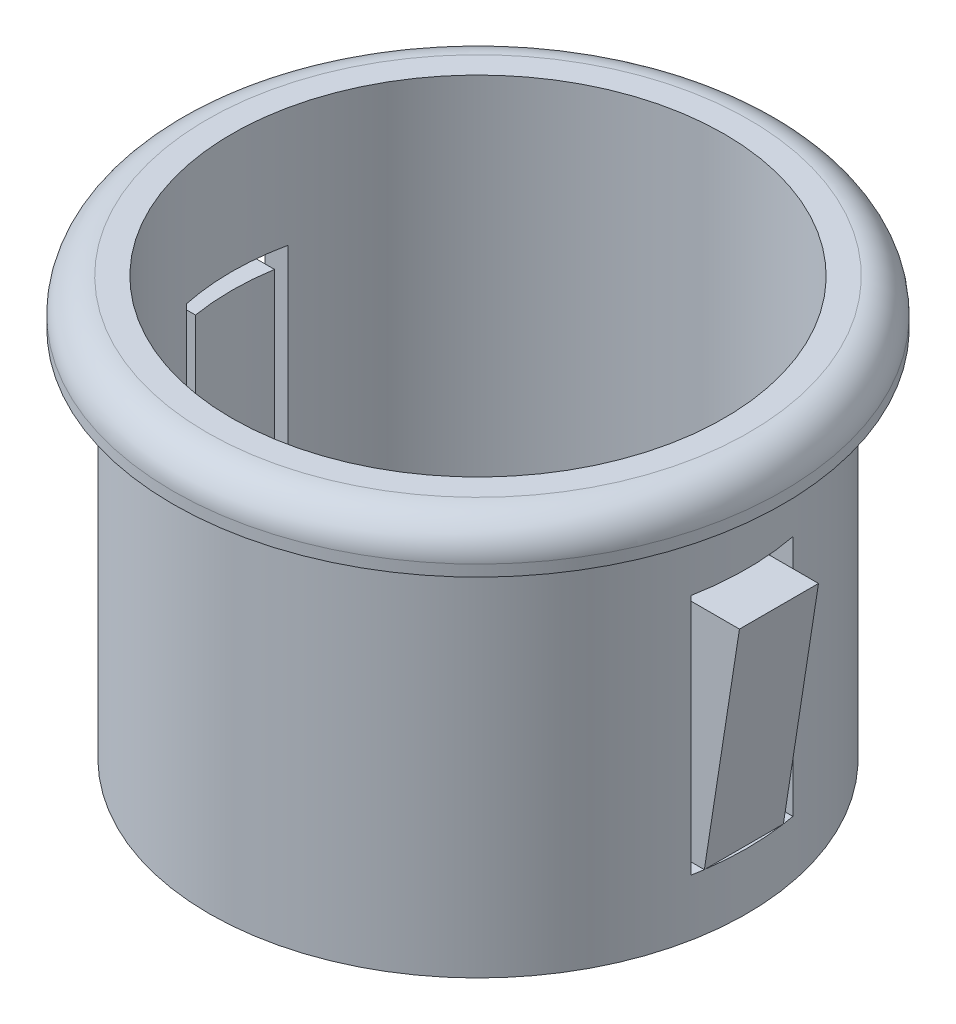
ISO-10303-21;
HEADER;
FILE_DESCRIPTION(('STEP AP214'),'2;1');
FILE_NAME('part.step','',(''),(''),'','','');
FILE_SCHEMA(('AUTOMOTIVE_DESIGN { 1 0 10303 214 1 1 1 1 }'));
ENDSEC;
DATA;
#1=APPLICATION_CONTEXT('core data for automotive mechanical design processes');
#2=APPLICATION_PROTOCOL_DEFINITION('international standard','automotive_design',2000,#1);
#3=PRODUCT_CONTEXT('',#1,'mechanical');
#4=PRODUCT('Part','Part','',(#3));
#5=PRODUCT_RELATED_PRODUCT_CATEGORY('part','',(#4));
#6=PRODUCT_DEFINITION_FORMATION('','',#4);
#7=PRODUCT_DEFINITION_CONTEXT('part definition',#1,'design');
#8=PRODUCT_DEFINITION('design','',#6,#7);
#9=PRODUCT_DEFINITION_SHAPE('','',#8);
#10=(LENGTH_UNIT() NAMED_UNIT(*) SI_UNIT(.MILLI.,.METRE.));
#11=(NAMED_UNIT(*) PLANE_ANGLE_UNIT() SI_UNIT($,.RADIAN.));
#12=(NAMED_UNIT(*) SI_UNIT($,.STERADIAN.) SOLID_ANGLE_UNIT());
#13=UNCERTAINTY_MEASURE_WITH_UNIT(LENGTH_MEASURE(1.E-05),#10,'distance_accuracy_value','');
#14=(GEOMETRIC_REPRESENTATION_CONTEXT(3) GLOBAL_UNCERTAINTY_ASSIGNED_CONTEXT((#13)) GLOBAL_UNIT_ASSIGNED_CONTEXT((#10,
#11,#12)) REPRESENTATION_CONTEXT('',''));
#15=CARTESIAN_POINT('',(0.,0.,0.));
#16=DIRECTION('',(0.,0.,1.));
#17=DIRECTION('',(1.,0.,0.));
#18=AXIS2_PLACEMENT_3D('',#15,#16,#17);
#19=CARTESIAN_POINT('',(-17.1,2.5011409756876,2.24750468608904));
#20=DIRECTION('',(0.,-1.,0.));
#21=DIRECTION('',(0.,0.,-1.));
#22=AXIS2_PLACEMENT_3D('',#19,#20,#21);
#23=PLANE('',#22);
#24=CARTESIAN_POINT('',(0.,2.5011409756876,0.));
#25=DIRECTION('',(0.,-1.,0.));
#26=DIRECTION('',(0.,0.,-1.));
#27=AXIS2_PLACEMENT_3D('',#24,#25,#26);
#28=CIRCLE('',#27,10.9);
#29=CARTESIAN_POINT('',(10.6647205711546,2.5011409756876,-2.25249531391097));
#30=VERTEX_POINT('',#29);
#31=CARTESIAN_POINT('',(10.7586012101946,2.5011409756876,-1.75));
#32=VERTEX_POINT('',#31);
#33=EDGE_CURVE('E239',#30,#32,#28,.T.);
#34=ORIENTED_EDGE('',*,*,#33,.T.);
#35=DIRECTION('',(-1.,0.,0.));
#36=VECTOR('',#35,1.);
#37=CARTESIAN_POINT('',(-17.1,2.5011409756876,-1.75));
#38=LINE('',#37,#36);
#39=CARTESIAN_POINT('',(11.7706202045602,2.5011409756876,-1.75));
#40=VERTEX_POINT('',#39);
#41=EDGE_CURVE('E272',#40,#32,#38,.T.);
#42=ORIENTED_EDGE('',*,*,#41,.F.);
#43=CARTESIAN_POINT('',(0.,2.5011409756876,0.));
#44=DIRECTION('',(0.,-1.,0.));
#45=DIRECTION('',(0.,0.,-1.));
#46=AXIS2_PLACEMENT_3D('',#43,#44,#45);
#47=CIRCLE('',#46,11.9);
#48=CARTESIAN_POINT('',(11.6848733352488,2.5011409756876,-2.25249531391097));
#49=VERTEX_POINT('',#48);
#50=EDGE_CURVE('E377',#49,#40,#47,.T.);
#51=ORIENTED_EDGE('',*,*,#50,.F.);
#52=DIRECTION('',(1.,0.,0.));
#53=VECTOR('',#52,1.);
#54=CARTESIAN_POINT('',(-17.1,2.5011409756876,-2.25249531391096));
#55=LINE('',#54,#53);
#56=EDGE_CURVE('E358',#30,#49,#55,.T.);
#57=ORIENTED_EDGE('',*,*,#56,.F.);
#58=EDGE_LOOP('',(#34,#42,#51,#57));
#59=FACE_BOUND('',#58,.T.);
#60=ADVANCED_FACE('F41',(#59),#23,.F.);
#61=DIRECTION('',(1.,0.,0.));
#62=VECTOR('',#61,1.);
#63=CARTESIAN_POINT('',(-17.1,2.5011409756876,-1.75));
#64=LINE('',#63,#62);
#65=CARTESIAN_POINT('',(-11.7706202045602,2.5011409756876,-1.75));
#66=VERTEX_POINT('',#65);
#67=CARTESIAN_POINT('',(-10.7586012101946,2.5011409756876,-1.75));
#68=VERTEX_POINT('',#67);
#69=EDGE_CURVE('E209',#66,#68,#64,.T.);
#70=ORIENTED_EDGE('',*,*,#69,.T.);
#71=CARTESIAN_POINT('',(-10.6647205711546,2.5011409756876,-2.25249531391097));
#72=VERTEX_POINT('',#71);
#73=EDGE_CURVE('E222',#68,#72,#28,.T.);
#74=ORIENTED_EDGE('',*,*,#73,.T.);
#75=CARTESIAN_POINT('',(-11.6848733352488,2.5011409756876,-2.25249531391097));
#76=VERTEX_POINT('',#75);
#77=EDGE_CURVE('E362',#76,#72,#55,.T.);
#78=ORIENTED_EDGE('',*,*,#77,.F.);
#79=EDGE_CURVE('E224',#66,#76,#47,.T.);
#80=ORIENTED_EDGE('',*,*,#79,.F.);
#81=EDGE_LOOP('',(#70,#74,#78,#80));
#82=FACE_BOUND('',#81,.T.);
#83=ADVANCED_FACE('F220',(#82),#23,.F.);
#84=CARTESIAN_POINT('',(-10.665773421839,2.5011409756876,2.24750468608903));
#85=VERTEX_POINT('',#84);
#86=CARTESIAN_POINT('',(-10.7586012101946,2.5011409756876,1.75));
#87=VERTEX_POINT('',#86);
#88=EDGE_CURVE('E236',#85,#87,#28,.T.);
#89=ORIENTED_EDGE('',*,*,#88,.T.);
#90=DIRECTION('',(1.,0.,0.));
#91=VECTOR('',#90,1.);
#92=CARTESIAN_POINT('',(-17.1,2.5011409756876,1.75));
#93=LINE('',#92,#91);
#94=CARTESIAN_POINT('',(-11.7706202045602,2.5011409756876,1.75));
#95=VERTEX_POINT('',#94);
#96=EDGE_CURVE('E227',#95,#87,#93,.T.);
#97=ORIENTED_EDGE('',*,*,#96,.F.);
#98=CARTESIAN_POINT('',(-11.685834274283,2.5011409756876,2.24750468608903));
#99=VERTEX_POINT('',#98);
#100=EDGE_CURVE('E371',#99,#95,#47,.T.);
#101=ORIENTED_EDGE('',*,*,#100,.F.);
#102=DIRECTION('',(1.,0.,0.));
#103=VECTOR('',#102,1.);
#104=CARTESIAN_POINT('',(-17.1,2.5011409756876,2.24750468608904));
#105=LINE('',#104,#103);
#106=EDGE_CURVE('E363',#99,#85,#105,.T.);
#107=ORIENTED_EDGE('',*,*,#106,.T.);
#108=EDGE_LOOP('',(#89,#97,#101,#107));
#109=FACE_BOUND('',#108,.T.);
#110=ADVANCED_FACE('F500',(#109),#23,.F.);
#111=CARTESIAN_POINT('',(0.,12.5011409756876,-1.75));
#112=DIRECTION('',(0.,0.,1.));
#113=DIRECTION('',(1.,0.,0.));
#114=AXIS2_PLACEMENT_3D('',#111,#112,#113);
#115=PLANE('',#114);
#116=ORIENTED_EDGE('',*,*,#41,.T.);
#117=DIRECTION('',(0.,1.,0.));
#118=VECTOR('',#117,1.);
#119=CARTESIAN_POINT('',(10.7586012101946,-28.3298556597335,-1.75));
#120=LINE('',#119,#118);
#121=CARTESIAN_POINT('',(10.7586012101946,12.5011409756876,-1.75));
#122=VERTEX_POINT('',#121);
#123=EDGE_CURVE('E57',#32,#122,#120,.T.);
#124=ORIENTED_EDGE('',*,*,#123,.T.);
#125=DIRECTION('',(-1.,0.,0.));
#126=VECTOR('',#125,1.);
#127=CARTESIAN_POINT('',(0.,12.5011409756876,-1.75));
#128=LINE('',#127,#126);
#129=CARTESIAN_POINT('',(13.325,12.5011409756876,-1.75));
#130=VERTEX_POINT('',#129);
#131=EDGE_CURVE('E330',#130,#122,#128,.T.);
#132=ORIENTED_EDGE('',*,*,#131,.F.);
#133=DIRECTION('',(0.153593569272711,0.988134108043068,0.));
#134=VECTOR('',#133,1.);
#135=CARTESIAN_POINT('',(13.0106501312453,10.4787918067332,-1.75));
#136=LINE('',#135,#134);
#137=EDGE_CURVE('E323',#40,#130,#136,.T.);
#138=ORIENTED_EDGE('',*,*,#137,.F.);
#139=EDGE_LOOP('',(#116,#124,#132,#138));
#140=FACE_BOUND('',#139,.T.);
#141=ADVANCED_FACE('F614',(#140),#115,.F.);
#142=CARTESIAN_POINT('',(0.,12.5011409756876,1.75));
#143=DIRECTION('',(0.,0.,1.));
#144=DIRECTION('',(1.,0.,0.));
#145=AXIS2_PLACEMENT_3D('',#142,#143,#144);
#146=PLANE('',#145);
#147=DIRECTION('',(0.,1.,0.));
#148=VECTOR('',#147,1.);
#149=CARTESIAN_POINT('',(10.7586012101946,-28.3298556597335,1.75));
#150=LINE('',#149,#148);
#151=CARTESIAN_POINT('',(10.7586012101946,2.5011409756876,1.75));
#152=VERTEX_POINT('',#151);
#153=CARTESIAN_POINT('',(10.7586012101946,12.5011409756876,1.75));
#154=VERTEX_POINT('',#153);
#155=EDGE_CURVE('E620',#152,#154,#150,.T.);
#156=ORIENTED_EDGE('',*,*,#155,.F.);
#157=DIRECTION('',(-1.,0.,0.));
#158=VECTOR('',#157,1.);
#159=CARTESIAN_POINT('',(-17.1,2.5011409756876,1.75));
#160=LINE('',#159,#158);
#161=CARTESIAN_POINT('',(11.7706202045602,2.5011409756876,1.75));
#162=VERTEX_POINT('',#161);
#163=EDGE_CURVE('E269',#162,#152,#160,.T.);
#164=ORIENTED_EDGE('',*,*,#163,.F.);
#165=DIRECTION('',(0.153593569272711,0.988134108043068,0.));
#166=VECTOR('',#165,1.);
#167=CARTESIAN_POINT('',(11.7706202045602,2.5011409756876,1.75));
#168=LINE('',#167,#166);
#169=CARTESIAN_POINT('',(13.325,12.5011409756876,1.75));
#170=VERTEX_POINT('',#169);
#171=EDGE_CURVE('E316',#162,#170,#168,.T.);
#172=ORIENTED_EDGE('',*,*,#171,.T.);
#173=DIRECTION('',(-1.,0.,0.));
#174=VECTOR('',#173,1.);
#175=CARTESIAN_POINT('',(0.,12.5011409756876,1.75));
#176=LINE('',#175,#174);
#177=EDGE_CURVE('E334',#170,#154,#176,.T.);
#178=ORIENTED_EDGE('',*,*,#177,.T.);
#179=EDGE_LOOP('',(#156,#164,#172,#178));
#180=FACE_BOUND('',#179,.T.);
#181=ADVANCED_FACE('F498',(#180),#146,.T.);
#182=ORIENTED_EDGE('',*,*,#163,.T.);
#183=CARTESIAN_POINT('',(10.665773421839,2.5011409756876,2.24750468608903));
#184=VERTEX_POINT('',#183);
#185=EDGE_CURVE('E240',#152,#184,#28,.T.);
#186=ORIENTED_EDGE('',*,*,#185,.T.);
#187=CARTESIAN_POINT('',(11.685834274283,2.5011409756876,2.24750468608903));
#188=VERTEX_POINT('',#187);
#189=EDGE_CURVE('E357',#184,#188,#105,.T.);
#190=ORIENTED_EDGE('',*,*,#189,.T.);
#191=EDGE_CURVE('E375',#162,#188,#47,.T.);
#192=ORIENTED_EDGE('',*,*,#191,.F.);
#193=EDGE_LOOP('',(#182,#186,#190,#192));
#194=FACE_BOUND('',#193,.T.);
#195=ADVANCED_FACE('F488',(#194),#23,.F.);
#196=CARTESIAN_POINT('',(0.,2.5,0.));
#197=DIRECTION('',(0.,-1.,0.));
#198=DIRECTION('',(0.,0.,-1.));
#199=AXIS2_PLACEMENT_3D('',#196,#197,#198);
#200=CYLINDRICAL_SURFACE('',#199,11.9);
#201=CARTESIAN_POINT('',(0.,13.2211409756876,0.));
#202=DIRECTION('',(0.,1.,0.));
#203=DIRECTION('',(0.,0.,1.));
#204=AXIS2_PLACEMENT_3D('',#201,#202,#203);
#205=CIRCLE('',#204,11.9);
#206=CARTESIAN_POINT('',(-11.6848733352488,13.2211409756876,-2.25249531391097));
#207=VERTEX_POINT('',#206);
#208=CARTESIAN_POINT('',(-11.685834274283,13.2211409756876,2.24750468608903));
#209=VERTEX_POINT('',#208);
#210=EDGE_CURVE('E302',#207,#209,#205,.T.);
#211=ORIENTED_EDGE('',*,*,#210,.T.);
#212=DIRECTION('',(0.,-1.,0.));
#213=VECTOR('',#212,1.);
#214=CARTESIAN_POINT('',(-11.685834274283,2.5,2.24750468608903));
#215=LINE('',#214,#213);
#216=EDGE_CURVE('E300',#209,#99,#215,.T.);
#217=ORIENTED_EDGE('',*,*,#216,.T.);
#218=ORIENTED_EDGE('',*,*,#100,.T.);
#219=EDGE_CURVE('E376',#95,#66,#47,.T.);
#220=ORIENTED_EDGE('',*,*,#219,.T.);
#221=ORIENTED_EDGE('',*,*,#79,.T.);
#222=DIRECTION('',(0.,-1.,0.));
#223=VECTOR('',#222,1.);
#224=CARTESIAN_POINT('',(-11.6848733352488,2.5,-2.25249531391097));
#225=LINE('',#224,#223);
#226=EDGE_CURVE('E378',#76,#207,#225,.F.);
#227=ORIENTED_EDGE('',*,*,#226,.T.);
#228=EDGE_LOOP('',(#211,#217,#218,#220,#221,#227));
#229=FACE_BOUND('',#228,.T.);
#230=DIRECTION('',(0.,-1.,0.));
#231=VECTOR('',#230,1.);
#232=CARTESIAN_POINT('',(11.685834274283,2.5,2.24750468608903));
#233=LINE('',#232,#231);
#234=CARTESIAN_POINT('',(11.685834274283,13.2211409756876,2.24750468608903));
#235=VERTEX_POINT('',#234);
#236=EDGE_CURVE('E366',#188,#235,#233,.F.);
#237=ORIENTED_EDGE('',*,*,#236,.T.);
#238=CARTESIAN_POINT('',(11.6848733352488,13.2211409756876,-2.25249531391097));
#239=VERTEX_POINT('',#238);
#240=EDGE_CURVE('E307',#235,#239,#205,.T.);
#241=ORIENTED_EDGE('',*,*,#240,.T.);
#242=DIRECTION('',(0.,-1.,0.));
#243=VECTOR('',#242,1.);
#244=CARTESIAN_POINT('',(11.6848733352488,2.5,-2.25249531391097));
#245=LINE('',#244,#243);
#246=EDGE_CURVE('E381',#239,#49,#245,.T.);
#247=ORIENTED_EDGE('',*,*,#246,.T.);
#248=ORIENTED_EDGE('',*,*,#50,.T.);
#249=EDGE_CURVE('E585',#40,#162,#47,.T.);
#250=ORIENTED_EDGE('',*,*,#249,.T.);
#251=ORIENTED_EDGE('',*,*,#191,.T.);
#252=EDGE_LOOP('',(#237,#241,#247,#248,#250,#251));
#253=FACE_BOUND('',#252,.T.);
#254=CARTESIAN_POINT('',(0.,0.,0.));
#255=DIRECTION('',(0.,1.,0.));
#256=DIRECTION('',(0.,0.,1.));
#257=AXIS2_PLACEMENT_3D('',#254,#255,#256);
#258=CIRCLE('',#257,11.9);
#259=CARTESIAN_POINT('',(0.,0.,11.9));
#260=VERTEX_POINT('',#259);
#261=EDGE_CURVE('E464',#260,#260,#258,.T.);
#262=ORIENTED_EDGE('',*,*,#261,.T.);
#263=EDGE_LOOP('',(#262));
#264=FACE_BOUND('',#263,.T.);
#265=CARTESIAN_POINT('',(0.,16.5,0.));
#266=DIRECTION('',(0.,1.,0.));
#267=DIRECTION('',(0.,0.,1.));
#268=AXIS2_PLACEMENT_3D('',#265,#266,#267);
#269=CIRCLE('',#268,11.9);
#270=CARTESIAN_POINT('',(0.,16.5,11.9));
#271=VERTEX_POINT('',#270);
#272=EDGE_CURVE('E244',#271,#271,#269,.T.);
#273=ORIENTED_EDGE('',*,*,#272,.F.);
#274=EDGE_LOOP('',(#273));
#275=FACE_BOUND('',#274,.T.);
#276=ADVANCED_FACE('F485',(#229,#253,#264,#275),#200,.T.);
#277=CARTESIAN_POINT('',(-7.,2.5,7.));
#278=DIRECTION('',(0.,0.,-1.));
#279=DIRECTION('',(-1.,0.,0.));
#280=AXIS2_PLACEMENT_3D('',#277,#278,#279);
#281=PLANE('',#280);
#282=DIRECTION('',(0.,1.,0.));
#283=VECTOR('',#282,1.);
#284=CARTESIAN_POINT('',(-2.25,2.5,7.));
#285=LINE('',#284,#283);
#286=CARTESIAN_POINT('',(-2.25,0.,7.));
#287=VERTEX_POINT('',#286);
#288=CARTESIAN_POINT('',(-2.25,2.5,7.));
#289=VERTEX_POINT('',#288);
#290=EDGE_CURVE('E471',#287,#289,#285,.T.);
#291=ORIENTED_EDGE('',*,*,#290,.F.);
#292=DIRECTION('',(1.,0.,0.));
#293=VECTOR('',#292,1.);
#294=CARTESIAN_POINT('',(-7.,0.,7.));
#295=LINE('',#294,#293);
#296=CARTESIAN_POINT('',(-7.,0.,7.));
#297=VERTEX_POINT('',#296);
#298=EDGE_CURVE('E423',#297,#287,#295,.T.);
#299=ORIENTED_EDGE('',*,*,#298,.F.);
#300=DIRECTION('',(0.,-1.,0.));
#301=VECTOR('',#300,1.);
#302=CARTESIAN_POINT('',(-7.,2.5,7.));
#303=LINE('',#302,#301);
#304=CARTESIAN_POINT('',(-7.,2.5,7.));
#305=VERTEX_POINT('',#304);
#306=EDGE_CURVE('E454',#305,#297,#303,.T.);
#307=ORIENTED_EDGE('',*,*,#306,.F.);
#308=DIRECTION('',(1.,0.,0.));
#309=VECTOR('',#308,1.);
#310=CARTESIAN_POINT('',(-7.,2.5,7.));
#311=LINE('',#310,#309);
#312=EDGE_CURVE('E431',#305,#289,#311,.T.);
#313=ORIENTED_EDGE('',*,*,#312,.T.);
#314=EDGE_LOOP('',(#291,#299,#307,#313));
#315=FACE_BOUND('',#314,.T.);
#316=ADVANCED_FACE('F487',(#315),#281,.T.);
#317=CARTESIAN_POINT('',(0.,2.5,0.));
#318=DIRECTION('',(0.,1.,0.));
#319=DIRECTION('',(0.,0.,1.));
#320=AXIS2_PLACEMENT_3D('',#317,#318,#319);
#321=PLANE('',#320);
#322=CARTESIAN_POINT('',(0.,2.5,0.));
#323=DIRECTION('',(0.,1.,0.));
#324=DIRECTION('',(0.,0.,1.));
#325=AXIS2_PLACEMENT_3D('',#322,#323,#324);
#326=CIRCLE('',#325,10.9);
#327=CARTESIAN_POINT('',(0.,2.5,10.9));
#328=VERTEX_POINT('',#327);
#329=EDGE_CURVE('E474',#328,#328,#326,.F.);
#330=ORIENTED_EDGE('',*,*,#329,.F.);
#331=EDGE_LOOP('',(#330));
#332=FACE_BOUND('',#331,.T.);
#333=DIRECTION('',(0.,0.,1.));
#334=VECTOR('',#333,1.);
#335=CARTESIAN_POINT('',(-2.25,2.5,0.));
#336=LINE('',#335,#334);
#337=CARTESIAN_POINT('',(-2.25,2.5,7.45));
#338=VERTEX_POINT('',#337);
#339=EDGE_CURVE('E412',#289,#338,#336,.T.);
#340=ORIENTED_EDGE('',*,*,#339,.F.);
#341=ORIENTED_EDGE('',*,*,#312,.F.);
#342=DIRECTION('',(0.,0.,1.));
#343=VECTOR('',#342,1.);
#344=CARTESIAN_POINT('',(-7.,2.5,7.));
#345=LINE('',#344,#343);
#346=CARTESIAN_POINT('',(-7.,2.5,-7.));
#347=VERTEX_POINT('',#346);
#348=EDGE_CURVE('E426',#347,#305,#345,.T.);
#349=ORIENTED_EDGE('',*,*,#348,.F.);
#350=DIRECTION('',(-1.,0.,0.));
#351=VECTOR('',#350,1.);
#352=CARTESIAN_POINT('',(-7.,2.5,-7.));
#353=LINE('',#352,#351);
#354=CARTESIAN_POINT('',(7.,2.5,-7.));
#355=VERTEX_POINT('',#354);
#356=EDGE_CURVE('E422',#355,#347,#353,.T.);
#357=ORIENTED_EDGE('',*,*,#356,.F.);
#358=DIRECTION('',(0.,0.,-1.));
#359=VECTOR('',#358,1.);
#360=CARTESIAN_POINT('',(7.,2.5,7.));
#361=LINE('',#360,#359);
#362=CARTESIAN_POINT('',(7.,2.5,7.));
#363=VERTEX_POINT('',#362);
#364=EDGE_CURVE('E419',#363,#355,#361,.T.);
#365=ORIENTED_EDGE('',*,*,#364,.F.);
#366=CARTESIAN_POINT('',(2.25,2.5,7.));
#367=VERTEX_POINT('',#366);
#368=EDGE_CURVE('E430',#367,#363,#311,.T.);
#369=ORIENTED_EDGE('',*,*,#368,.F.);
#370=DIRECTION('',(0.,0.,-1.));
#371=VECTOR('',#370,1.);
#372=CARTESIAN_POINT('',(2.25,2.5,0.));
#373=LINE('',#372,#371);
#374=CARTESIAN_POINT('',(2.25,2.5,7.45));
#375=VERTEX_POINT('',#374);
#376=EDGE_CURVE('E65',#375,#367,#373,.T.);
#377=ORIENTED_EDGE('',*,*,#376,.F.);
#378=DIRECTION('',(1.,0.,0.));
#379=VECTOR('',#378,1.);
#380=CARTESIAN_POINT('',(0.,2.5,7.45));
#381=LINE('',#380,#379);
#382=EDGE_CURVE('E415',#338,#375,#381,.T.);
#383=ORIENTED_EDGE('',*,*,#382,.F.);
#384=EDGE_LOOP('',(#340,#341,#349,#357,#365,#369,#377,#383));
#385=FACE_BOUND('',#384,.T.);
#386=ADVANCED_FACE('F494',(#332,#385),#321,.T.);
#387=CARTESIAN_POINT('',(0.,0.,0.));
#388=DIRECTION('',(0.,1.,0.));
#389=DIRECTION('',(0.,0.,1.));
#390=AXIS2_PLACEMENT_3D('',#387,#388,#389);
#391=PLANE('',#390);
#392=ORIENTED_EDGE('',*,*,#261,.F.);
#393=EDGE_LOOP('',(#392));
#394=FACE_BOUND('',#393,.T.);
#395=ORIENTED_EDGE('',*,*,#298,.T.);
#396=DIRECTION('',(0.,0.,-1.));
#397=VECTOR('',#396,1.);
#398=CARTESIAN_POINT('',(-2.25,0.,6.55));
#399=LINE('',#398,#397);
#400=CARTESIAN_POINT('',(-2.25,0.,7.45));
#401=VERTEX_POINT('',#400);
#402=EDGE_CURVE('E393',#401,#287,#399,.T.);
#403=ORIENTED_EDGE('',*,*,#402,.F.);
#404=DIRECTION('',(-1.,0.,0.));
#405=VECTOR('',#404,1.);
#406=CARTESIAN_POINT('',(2.25,0.,7.45));
#407=LINE('',#406,#405);
#408=CARTESIAN_POINT('',(2.25,0.,7.45));
#409=VERTEX_POINT('',#408);
#410=EDGE_CURVE('E400',#409,#401,#407,.T.);
#411=ORIENTED_EDGE('',*,*,#410,.F.);
#412=DIRECTION('',(0.,0.,1.));
#413=VECTOR('',#412,1.);
#414=CARTESIAN_POINT('',(2.25,0.,6.55));
#415=LINE('',#414,#413);
#416=CARTESIAN_POINT('',(2.25,0.,7.));
#417=VERTEX_POINT('',#416);
#418=EDGE_CURVE('E396',#417,#409,#415,.T.);
#419=ORIENTED_EDGE('',*,*,#418,.F.);
#420=CARTESIAN_POINT('',(7.,0.,7.));
#421=VERTEX_POINT('',#420);
#422=EDGE_CURVE('E447',#417,#421,#295,.T.);
#423=ORIENTED_EDGE('',*,*,#422,.T.);
#424=DIRECTION('',(0.,0.,-1.));
#425=VECTOR('',#424,1.);
#426=CARTESIAN_POINT('',(7.,0.,7.));
#427=LINE('',#426,#425);
#428=CARTESIAN_POINT('',(7.,0.,-7.));
#429=VERTEX_POINT('',#428);
#430=EDGE_CURVE('E418',#421,#429,#427,.T.);
#431=ORIENTED_EDGE('',*,*,#430,.T.);
#432=DIRECTION('',(-1.,0.,0.));
#433=VECTOR('',#432,1.);
#434=CARTESIAN_POINT('',(-7.,0.,-7.));
#435=LINE('',#434,#433);
#436=CARTESIAN_POINT('',(-7.,0.,-7.));
#437=VERTEX_POINT('',#436);
#438=EDGE_CURVE('E439',#429,#437,#435,.T.);
#439=ORIENTED_EDGE('',*,*,#438,.T.);
#440=DIRECTION('',(0.,0.,1.));
#441=VECTOR('',#440,1.);
#442=CARTESIAN_POINT('',(-7.,0.,7.));
#443=LINE('',#442,#441);
#444=EDGE_CURVE('E443',#437,#297,#443,.T.);
#445=ORIENTED_EDGE('',*,*,#444,.T.);
#446=EDGE_LOOP('',(#395,#403,#411,#419,#423,#431,#439,#445));
#447=FACE_BOUND('',#446,.T.);
#448=ADVANCED_FACE('F555',(#394,#447),#391,.F.);
#449=CARTESIAN_POINT('',(7.,2.5,7.));
#450=DIRECTION('',(-1.,0.,0.));
#451=DIRECTION('',(0.,0.,1.));
#452=AXIS2_PLACEMENT_3D('',#449,#450,#451);
#453=PLANE('',#452);
#454=ORIENTED_EDGE('',*,*,#430,.F.);
#455=DIRECTION('',(0.,-1.,0.));
#456=VECTOR('',#455,1.);
#457=CARTESIAN_POINT('',(7.,2.5,7.));
#458=LINE('',#457,#456);
#459=EDGE_CURVE('E435',#363,#421,#458,.T.);
#460=ORIENTED_EDGE('',*,*,#459,.F.);
#461=ORIENTED_EDGE('',*,*,#364,.T.);
#462=DIRECTION('',(0.,-1.,0.));
#463=VECTOR('',#462,1.);
#464=CARTESIAN_POINT('',(7.,2.5,-7.));
#465=LINE('',#464,#463);
#466=EDGE_CURVE('E460',#355,#429,#465,.T.);
#467=ORIENTED_EDGE('',*,*,#466,.T.);
#468=EDGE_LOOP('',(#454,#460,#461,#467));
#469=FACE_BOUND('',#468,.T.);
#470=ADVANCED_FACE('F551',(#469),#453,.T.);
#471=CARTESIAN_POINT('',(-7.,2.5,-7.));
#472=DIRECTION('',(0.,0.,1.));
#473=DIRECTION('',(1.,0.,0.));
#474=AXIS2_PLACEMENT_3D('',#471,#472,#473);
#475=PLANE('',#474);
#476=ORIENTED_EDGE('',*,*,#438,.F.);
#477=ORIENTED_EDGE('',*,*,#466,.F.);
#478=ORIENTED_EDGE('',*,*,#356,.T.);
#479=DIRECTION('',(0.,-1.,0.));
#480=VECTOR('',#479,1.);
#481=CARTESIAN_POINT('',(-7.,2.5,-7.));
#482=LINE('',#481,#480);
#483=EDGE_CURVE('E457',#347,#437,#482,.T.);
#484=ORIENTED_EDGE('',*,*,#483,.T.);
#485=EDGE_LOOP('',(#476,#477,#478,#484));
#486=FACE_BOUND('',#485,.T.);
#487=ADVANCED_FACE('F547',(#486),#475,.T.);
#488=CARTESIAN_POINT('',(-7.,2.5,7.));
#489=DIRECTION('',(1.,0.,0.));
#490=DIRECTION('',(0.,0.,-1.));
#491=AXIS2_PLACEMENT_3D('',#488,#489,#490);
#492=PLANE('',#491);
#493=ORIENTED_EDGE('',*,*,#444,.F.);
#494=ORIENTED_EDGE('',*,*,#483,.F.);
#495=ORIENTED_EDGE('',*,*,#348,.T.);
#496=ORIENTED_EDGE('',*,*,#306,.T.);
#497=EDGE_LOOP('',(#493,#494,#495,#496));
#498=FACE_BOUND('',#497,.T.);
#499=ADVANCED_FACE('F543',(#498),#492,.T.);
#500=DIRECTION('',(0.,-1.,0.));
#501=VECTOR('',#500,1.);
#502=CARTESIAN_POINT('',(2.25,2.5,7.));
#503=LINE('',#502,#501);
#504=EDGE_CURVE('E468',#367,#417,#503,.T.);
#505=ORIENTED_EDGE('',*,*,#504,.F.);
#506=ORIENTED_EDGE('',*,*,#368,.T.);
#507=ORIENTED_EDGE('',*,*,#459,.T.);
#508=ORIENTED_EDGE('',*,*,#422,.F.);
#509=EDGE_LOOP('',(#505,#506,#507,#508));
#510=FACE_BOUND('',#509,.T.);
#511=ADVANCED_FACE('F497',(#510),#281,.T.);
#512=CARTESIAN_POINT('',(-2.25,11.5,6.55));
#513=DIRECTION('',(-1.,0.,0.));
#514=DIRECTION('',(0.,0.,1.));
#515=AXIS2_PLACEMENT_3D('',#512,#513,#514);
#516=PLANE('',#515);
#517=ORIENTED_EDGE('',*,*,#339,.T.);
#518=DIRECTION('',(0.,-1.,0.));
#519=VECTOR('',#518,1.);
#520=CARTESIAN_POINT('',(-2.25,11.5,7.45));
#521=LINE('',#520,#519);
#522=EDGE_CURVE('E405',#338,#401,#521,.T.);
#523=ORIENTED_EDGE('',*,*,#522,.T.);
#524=ORIENTED_EDGE('',*,*,#402,.T.);
#525=ORIENTED_EDGE('',*,*,#290,.T.);
#526=EDGE_LOOP('',(#517,#523,#524,#525));
#527=FACE_BOUND('',#526,.T.);
#528=ADVANCED_FACE('F535',(#527),#516,.F.);
#529=CARTESIAN_POINT('',(2.25,11.5,7.45));
#530=DIRECTION('',(0.,0.,1.));
#531=DIRECTION('',(1.,0.,0.));
#532=AXIS2_PLACEMENT_3D('',#529,#530,#531);
#533=PLANE('',#532);
#534=ORIENTED_EDGE('',*,*,#382,.T.);
#535=DIRECTION('',(0.,-1.,0.));
#536=VECTOR('',#535,1.);
#537=CARTESIAN_POINT('',(2.25,11.5,7.45));
#538=LINE('',#537,#536);
#539=EDGE_CURVE('E404',#375,#409,#538,.T.);
#540=ORIENTED_EDGE('',*,*,#539,.T.);
#541=ORIENTED_EDGE('',*,*,#410,.T.);
#542=ORIENTED_EDGE('',*,*,#522,.F.);
#543=EDGE_LOOP('',(#534,#540,#541,#542));
#544=FACE_BOUND('',#543,.T.);
#545=ADVANCED_FACE('F532',(#544),#533,.F.);
#546=CARTESIAN_POINT('',(2.25,11.5,6.55));
#547=DIRECTION('',(1.,0.,0.));
#548=DIRECTION('',(0.,0.,-1.));
#549=AXIS2_PLACEMENT_3D('',#546,#547,#548);
#550=PLANE('',#549);
#551=ORIENTED_EDGE('',*,*,#376,.T.);
#552=ORIENTED_EDGE('',*,*,#504,.T.);
#553=ORIENTED_EDGE('',*,*,#418,.T.);
#554=ORIENTED_EDGE('',*,*,#539,.F.);
#555=EDGE_LOOP('',(#551,#552,#553,#554));
#556=FACE_BOUND('',#555,.T.);
#557=ADVANCED_FACE('F531',(#556),#550,.F.);
#558=CARTESIAN_POINT('',(0.,18.5,0.));
#559=DIRECTION('',(0.,-1.,0.));
#560=DIRECTION('',(0.,0.,-1.));
#561=AXIS2_PLACEMENT_3D('',#558,#559,#560);
#562=CYLINDRICAL_SURFACE('',#561,10.9);
#563=CARTESIAN_POINT('',(0.,13.2211409756876,0.));
#564=DIRECTION('',(0.,1.,0.));
#565=DIRECTION('',(0.,0.,1.));
#566=AXIS2_PLACEMENT_3D('',#563,#564,#565);
#567=CIRCLE('',#566,10.9);
#568=CARTESIAN_POINT('',(10.665773421839,13.2211409756876,2.24750468608903));
#569=VERTEX_POINT('',#568);
#570=CARTESIAN_POINT('',(10.6647205711546,13.2211409756876,-2.25249531391097));
#571=VERTEX_POINT('',#570);
#572=EDGE_CURVE('E11',#569,#571,#567,.T.);
#573=ORIENTED_EDGE('',*,*,#572,.F.);
#574=DIRECTION('',(0.,-1.,0.));
#575=VECTOR('',#574,1.);
#576=CARTESIAN_POINT('',(10.665773421839,18.5,2.24750468608903));
#577=LINE('',#576,#575);
#578=EDGE_CURVE('E250',#184,#569,#577,.F.);
#579=ORIENTED_EDGE('',*,*,#578,.F.);
#580=ORIENTED_EDGE('',*,*,#185,.F.);
#581=ORIENTED_EDGE('',*,*,#155,.T.);
#582=CARTESIAN_POINT('',(0.,12.5011409756876,0.));
#583=DIRECTION('',(0.,1.,0.));
#584=DIRECTION('',(0.,0.,1.));
#585=AXIS2_PLACEMENT_3D('',#582,#583,#584);
#586=CIRCLE('',#585,10.9);
#587=EDGE_CURVE('E643',#154,#122,#586,.T.);
#588=ORIENTED_EDGE('',*,*,#587,.T.);
#589=ORIENTED_EDGE('',*,*,#123,.F.);
#590=ORIENTED_EDGE('',*,*,#33,.F.);
#591=DIRECTION('',(0.,-1.,0.));
#592=VECTOR('',#591,1.);
#593=CARTESIAN_POINT('',(10.6647205711546,18.5,-2.25249531391097));
#594=LINE('',#593,#592);
#595=EDGE_CURVE('E228',#571,#30,#594,.T.);
#596=ORIENTED_EDGE('',*,*,#595,.F.);
#597=EDGE_LOOP('',(#573,#579,#580,#581,#588,#589,#590,#596));
#598=FACE_BOUND('',#597,.T.);
#599=DIRECTION('',(0.,-1.,0.));
#600=VECTOR('',#599,1.);
#601=CARTESIAN_POINT('',(-10.665773421839,18.5,2.24750468608903));
#602=LINE('',#601,#600);
#603=CARTESIAN_POINT('',(-10.665773421839,13.2211409756876,2.24750468608903));
#604=VERTEX_POINT('',#603);
#605=EDGE_CURVE('E237',#604,#85,#602,.T.);
#606=ORIENTED_EDGE('',*,*,#605,.F.);
#607=CARTESIAN_POINT('',(-10.6647205711546,13.2211409756876,-2.25249531391097));
#608=VERTEX_POINT('',#607);
#609=EDGE_CURVE('E45',#608,#604,#567,.T.);
#610=ORIENTED_EDGE('',*,*,#609,.F.);
#611=DIRECTION('',(0.,-1.,0.));
#612=VECTOR('',#611,1.);
#613=CARTESIAN_POINT('',(-10.6647205711546,18.5,-2.25249531391097));
#614=LINE('',#613,#612);
#615=EDGE_CURVE('E234',#72,#608,#614,.F.);
#616=ORIENTED_EDGE('',*,*,#615,.F.);
#617=ORIENTED_EDGE('',*,*,#73,.F.);
#618=DIRECTION('',(0.,1.,0.));
#619=VECTOR('',#618,1.);
#620=CARTESIAN_POINT('',(-10.7586012101946,-28.3298556597335,-1.75));
#621=LINE('',#620,#619);
#622=CARTESIAN_POINT('',(-10.7586012101946,12.5011409756876,-1.75));
#623=VERTEX_POINT('',#622);
#624=EDGE_CURVE('E205',#68,#623,#621,.T.);
#625=ORIENTED_EDGE('',*,*,#624,.T.);
#626=CARTESIAN_POINT('',(0.,12.5011409756876,0.));
#627=DIRECTION('',(0.,1.,0.));
#628=DIRECTION('',(0.,0.,1.));
#629=AXIS2_PLACEMENT_3D('',#626,#627,#628);
#630=CIRCLE('',#629,10.9);
#631=CARTESIAN_POINT('',(-10.7586012101946,12.5011409756876,1.75));
#632=VERTEX_POINT('',#631);
#633=EDGE_CURVE('E636',#623,#632,#630,.T.);
#634=ORIENTED_EDGE('',*,*,#633,.T.);
#635=DIRECTION('',(0.,1.,0.));
#636=VECTOR('',#635,1.);
#637=CARTESIAN_POINT('',(-10.7586012101946,-28.3298556597335,1.75));
#638=LINE('',#637,#636);
#639=EDGE_CURVE('E217',#87,#632,#638,.T.);
#640=ORIENTED_EDGE('',*,*,#639,.F.);
#641=ORIENTED_EDGE('',*,*,#88,.F.);
#642=EDGE_LOOP('',(#606,#610,#616,#617,#625,#634,#640,#641));
#643=FACE_BOUND('',#642,.T.);
#644=CARTESIAN_POINT('',(0.,18.5,0.));
#645=DIRECTION('',(0.,1.,0.));
#646=DIRECTION('',(0.,0.,1.));
#647=AXIS2_PLACEMENT_3D('',#644,#645,#646);
#648=CIRCLE('',#647,10.9);
#649=CARTESIAN_POINT('',(0.,18.5,10.9));
#650=VERTEX_POINT('',#649);
#651=EDGE_CURVE('E389',#650,#650,#648,.T.);
#652=ORIENTED_EDGE('',*,*,#651,.T.);
#653=EDGE_LOOP('',(#652));
#654=FACE_BOUND('',#653,.T.);
#655=ORIENTED_EDGE('',*,*,#329,.T.);
#656=EDGE_LOOP('',(#655));
#657=FACE_BOUND('',#656,.T.);
#658=ADVANCED_FACE('F231',(#598,#643,#654,#657),#562,.F.);
#659=CARTESIAN_POINT('',(0.,18.5,0.));
#660=DIRECTION('',(0.,1.,0.));
#661=DIRECTION('',(0.,0.,1.));
#662=AXIS2_PLACEMENT_3D('',#659,#660,#661);
#663=PLANE('',#662);
#664=CARTESIAN_POINT('',(0.,18.5,0.));
#665=DIRECTION('',(0.,1.,0.));
#666=DIRECTION('',(0.,0.,1.));
#667=AXIS2_PLACEMENT_3D('',#664,#665,#666);
#668=CIRCLE('',#667,12.);
#669=CARTESIAN_POINT('',(0.,18.5,12.));
#670=VERTEX_POINT('',#669);
#671=EDGE_CURVE('E275',#670,#670,#668,.T.);
#672=ORIENTED_EDGE('',*,*,#671,.T.);
#673=EDGE_LOOP('',(#672));
#674=FACE_BOUND('',#673,.T.);
#675=ORIENTED_EDGE('',*,*,#651,.F.);
#676=EDGE_LOOP('',(#675));
#677=FACE_BOUND('',#676,.T.);
#678=ADVANCED_FACE('F525',(#674,#677),#663,.T.);
#679=CARTESIAN_POINT('',(0.,16.5,0.));
#680=DIRECTION('',(0.,1.,0.));
#681=DIRECTION('',(0.,0.,1.));
#682=AXIS2_PLACEMENT_3D('',#679,#680,#681);
#683=CYLINDRICAL_SURFACE('',#682,13.5);
#684=CARTESIAN_POINT('',(0.,17.,0.));
#685=DIRECTION('',(0.,1.,0.));
#686=DIRECTION('',(0.,0.,1.));
#687=AXIS2_PLACEMENT_3D('',#684,#685,#686);
#688=CIRCLE('',#687,13.5);
#689=CARTESIAN_POINT('',(0.,17.,13.5));
#690=VERTEX_POINT('',#689);
#691=EDGE_CURVE('E278',#690,#690,#688,.F.);
#692=ORIENTED_EDGE('',*,*,#691,.T.);
#693=EDGE_LOOP('',(#692));
#694=FACE_BOUND('',#693,.T.);
#695=CARTESIAN_POINT('',(0.,16.5,0.));
#696=DIRECTION('',(0.,1.,0.));
#697=DIRECTION('',(0.,0.,1.));
#698=AXIS2_PLACEMENT_3D('',#695,#696,#697);
#699=CIRCLE('',#698,13.5);
#700=CARTESIAN_POINT('',(0.,16.5,13.5));
#701=VERTEX_POINT('',#700);
#702=EDGE_CURVE('E385',#701,#701,#699,.T.);
#703=ORIENTED_EDGE('',*,*,#702,.T.);
#704=EDGE_LOOP('',(#703));
#705=FACE_BOUND('',#704,.T.);
#706=ADVANCED_FACE('F522',(#694,#705),#683,.T.);
#707=CARTESIAN_POINT('',(0.,16.5,0.));
#708=DIRECTION('',(0.,1.,0.));
#709=DIRECTION('',(0.,0.,1.));
#710=AXIS2_PLACEMENT_3D('',#707,#708,#709);
#711=PLANE('',#710);
#712=ORIENTED_EDGE('',*,*,#272,.T.);
#713=EDGE_LOOP('',(#712));
#714=FACE_BOUND('',#713,.T.);
#715=ORIENTED_EDGE('',*,*,#702,.F.);
#716=EDGE_LOOP('',(#715));
#717=FACE_BOUND('',#716,.T.);
#718=ADVANCED_FACE('F482',(#714,#717),#711,.F.);
#719=CARTESIAN_POINT('',(-17.1,2.5011409756876,2.24750468608904));
#720=DIRECTION('',(0.,0.,1.));
#721=DIRECTION('',(1.,0.,0.));
#722=AXIS2_PLACEMENT_3D('',#719,#720,#721);
#723=PLANE('',#722);
#724=ORIENTED_EDGE('',*,*,#216,.F.);
#725=DIRECTION('',(1.,0.,0.));
#726=VECTOR('',#725,1.);
#727=CARTESIAN_POINT('',(-18.1,13.2211409756876,2.24750468608904));
#728=LINE('',#727,#726);
#729=EDGE_CURVE('E291',#209,#604,#728,.T.);
#730=ORIENTED_EDGE('',*,*,#729,.T.);
#731=ORIENTED_EDGE('',*,*,#605,.T.);
#732=ORIENTED_EDGE('',*,*,#106,.F.);
#733=EDGE_LOOP('',(#724,#730,#731,#732));
#734=FACE_BOUND('',#733,.T.);
#735=ADVANCED_FACE('F296',(#734),#723,.F.);
#736=CARTESIAN_POINT('',(-17.1,2.5011409756876,-2.25249531391096));
#737=DIRECTION('',(0.,0.,-1.));
#738=DIRECTION('',(-1.,0.,0.));
#739=AXIS2_PLACEMENT_3D('',#736,#737,#738);
#740=PLANE('',#739);
#741=ORIENTED_EDGE('',*,*,#77,.T.);
#742=ORIENTED_EDGE('',*,*,#615,.T.);
#743=DIRECTION('',(1.,0.,0.));
#744=VECTOR('',#743,1.);
#745=CARTESIAN_POINT('',(-18.1,13.2211409756876,-2.25249531391096));
#746=LINE('',#745,#744);
#747=EDGE_CURVE('E294',#207,#608,#746,.T.);
#748=ORIENTED_EDGE('',*,*,#747,.F.);
#749=ORIENTED_EDGE('',*,*,#226,.F.);
#750=EDGE_LOOP('',(#741,#742,#748,#749));
#751=FACE_BOUND('',#750,.T.);
#752=ADVANCED_FACE('F514',(#751),#740,.F.);
#753=ORIENTED_EDGE('',*,*,#246,.F.);
#754=EDGE_CURVE('E312',#571,#239,#746,.T.);
#755=ORIENTED_EDGE('',*,*,#754,.F.);
#756=ORIENTED_EDGE('',*,*,#595,.T.);
#757=ORIENTED_EDGE('',*,*,#56,.T.);
#758=EDGE_LOOP('',(#753,#755,#756,#757));
#759=FACE_BOUND('',#758,.T.);
#760=ADVANCED_FACE('F516',(#759),#740,.F.);
#761=ORIENTED_EDGE('',*,*,#189,.F.);
#762=ORIENTED_EDGE('',*,*,#578,.T.);
#763=EDGE_CURVE('E303',#569,#235,#728,.T.);
#764=ORIENTED_EDGE('',*,*,#763,.T.);
#765=ORIENTED_EDGE('',*,*,#236,.F.);
#766=EDGE_LOOP('',(#761,#762,#764,#765));
#767=FACE_BOUND('',#766,.T.);
#768=ADVANCED_FACE('F515',(#767),#723,.F.);
#769=CARTESIAN_POINT('',(0.,12.5011409756876,1.75));
#770=DIRECTION('',(0.,0.,-1.));
#771=DIRECTION('',(-1.,0.,0.));
#772=AXIS2_PLACEMENT_3D('',#769,#770,#771);
#773=PLANE('',#772);
#774=ORIENTED_EDGE('',*,*,#96,.T.);
#775=ORIENTED_EDGE('',*,*,#639,.T.);
#776=DIRECTION('',(1.,0.,0.));
#777=VECTOR('',#776,1.);
#778=CARTESIAN_POINT('',(0.,12.5011409756876,1.75));
#779=LINE('',#778,#777);
#780=CARTESIAN_POINT('',(-13.325,12.5011409756876,1.75));
#781=VERTEX_POINT('',#780);
#782=EDGE_CURVE('E351',#781,#632,#779,.T.);
#783=ORIENTED_EDGE('',*,*,#782,.F.);
#784=DIRECTION('',(-0.153593569272711,0.988134108043068,0.));
#785=VECTOR('',#784,1.);
#786=CARTESIAN_POINT('',(-11.7706202045602,2.5011409756876,1.75));
#787=LINE('',#786,#785);
#788=EDGE_CURVE('E338',#95,#781,#787,.T.);
#789=ORIENTED_EDGE('',*,*,#788,.F.);
#790=EDGE_LOOP('',(#774,#775,#783,#789));
#791=FACE_BOUND('',#790,.T.);
#792=ADVANCED_FACE('F510',(#791),#773,.F.);
#793=CARTESIAN_POINT('',(0.,12.5011409756876,-1.75));
#794=DIRECTION('',(0.,0.,-1.));
#795=DIRECTION('',(-1.,0.,0.));
#796=AXIS2_PLACEMENT_3D('',#793,#794,#795);
#797=PLANE('',#796);
#798=ORIENTED_EDGE('',*,*,#624,.F.);
#799=ORIENTED_EDGE('',*,*,#69,.F.);
#800=DIRECTION('',(0.153593569272711,-0.988134108043068,0.));
#801=VECTOR('',#800,1.);
#802=CARTESIAN_POINT('',(-13.0106501312453,10.4787918067332,-1.75));
#803=LINE('',#802,#801);
#804=CARTESIAN_POINT('',(-13.325,12.5011409756876,-1.75));
#805=VERTEX_POINT('',#804);
#806=EDGE_CURVE('E345',#805,#66,#803,.T.);
#807=ORIENTED_EDGE('',*,*,#806,.F.);
#808=DIRECTION('',(1.,0.,0.));
#809=VECTOR('',#808,1.);
#810=CARTESIAN_POINT('',(0.,12.5011409756876,-1.75));
#811=LINE('',#810,#809);
#812=EDGE_CURVE('E212',#805,#623,#811,.T.);
#813=ORIENTED_EDGE('',*,*,#812,.T.);
#814=EDGE_LOOP('',(#798,#799,#807,#813));
#815=FACE_BOUND('',#814,.T.);
#816=ADVANCED_FACE('F207',(#815),#797,.T.);
#817=CARTESIAN_POINT('',(0.,12.5011409756876,0.));
#818=DIRECTION('',(0.,1.,0.));
#819=DIRECTION('',(0.,0.,1.));
#820=AXIS2_PLACEMENT_3D('',#817,#818,#819);
#821=PLANE('',#820);
#822=ORIENTED_EDGE('',*,*,#633,.F.);
#823=ORIENTED_EDGE('',*,*,#812,.F.);
#824=DIRECTION('',(0.,0.,-1.));
#825=VECTOR('',#824,1.);
#826=CARTESIAN_POINT('',(-13.325,12.5011409756876,0.));
#827=LINE('',#826,#825);
#828=EDGE_CURVE('E348',#781,#805,#827,.T.);
#829=ORIENTED_EDGE('',*,*,#828,.F.);
#830=ORIENTED_EDGE('',*,*,#782,.T.);
#831=EDGE_LOOP('',(#822,#823,#829,#830));
#832=FACE_BOUND('',#831,.T.);
#833=ADVANCED_FACE('F629',(#832),#821,.T.);
#834=CARTESIAN_POINT('',(-13.325,2.5011409756876,-8.25));
#835=DIRECTION('',(0.,-1.,0.));
#836=DIRECTION('',(0.,0.,-1.));
#837=AXIS2_PLACEMENT_3D('',#834,#835,#836);
#838=PLANE('',#837);
#839=DIRECTION('',(0.,0.,1.));
#840=VECTOR('',#839,1.);
#841=CARTESIAN_POINT('',(-11.7706202045602,2.5011409756876,-8.25));
#842=LINE('',#841,#840);
#843=EDGE_CURVE('E341',#66,#95,#842,.T.);
#844=ORIENTED_EDGE('',*,*,#843,.F.);
#845=ORIENTED_EDGE('',*,*,#219,.F.);
#846=EDGE_LOOP('',(#844,#845));
#847=FACE_BOUND('',#846,.T.);
#848=ADVANCED_FACE('F653',(#847),#838,.F.);
#849=CARTESIAN_POINT('',(-11.7706202045602,2.5011409756876,-8.25));
#850=DIRECTION('',(0.988134108043068,0.153593569272711,0.));
#851=DIRECTION('',(-0.153593569272711,0.988134108043068,0.));
#852=AXIS2_PLACEMENT_3D('',#849,#850,#851);
#853=PLANE('',#852);
#854=ORIENTED_EDGE('',*,*,#806,.T.);
#855=ORIENTED_EDGE('',*,*,#843,.T.);
#856=ORIENTED_EDGE('',*,*,#788,.T.);
#857=ORIENTED_EDGE('',*,*,#828,.T.);
#858=EDGE_LOOP('',(#854,#855,#856,#857));
#859=FACE_BOUND('',#858,.T.);
#860=ADVANCED_FACE('F650',(#859),#853,.F.);
#861=CARTESIAN_POINT('',(0.,12.5011409756876,0.));
#862=DIRECTION('',(0.,1.,0.));
#863=DIRECTION('',(0.,0.,1.));
#864=AXIS2_PLACEMENT_3D('',#861,#862,#863);
#865=PLANE('',#864);
#866=ORIENTED_EDGE('',*,*,#587,.F.);
#867=ORIENTED_EDGE('',*,*,#177,.F.);
#868=DIRECTION('',(0.,0.,-1.));
#869=VECTOR('',#868,1.);
#870=CARTESIAN_POINT('',(13.325,12.5011409756876,0.));
#871=LINE('',#870,#869);
#872=EDGE_CURVE('E326',#170,#130,#871,.T.);
#873=ORIENTED_EDGE('',*,*,#872,.T.);
#874=ORIENTED_EDGE('',*,*,#131,.T.);
#875=EDGE_LOOP('',(#866,#867,#873,#874));
#876=FACE_BOUND('',#875,.T.);
#877=ADVANCED_FACE('F618',(#876),#865,.T.);
#878=CARTESIAN_POINT('',(13.325,2.5011409756876,-8.25));
#879=DIRECTION('',(0.,1.,0.));
#880=DIRECTION('',(0.,0.,1.));
#881=AXIS2_PLACEMENT_3D('',#878,#879,#880);
#882=PLANE('',#881);
#883=ORIENTED_EDGE('',*,*,#249,.F.);
#884=DIRECTION('',(0.,0.,1.));
#885=VECTOR('',#884,1.);
#886=CARTESIAN_POINT('',(11.7706202045602,2.5011409756876,-8.25));
#887=LINE('',#886,#885);
#888=EDGE_CURVE('E320',#40,#162,#887,.T.);
#889=ORIENTED_EDGE('',*,*,#888,.T.);
#890=EDGE_LOOP('',(#883,#889));
#891=FACE_BOUND('',#890,.T.);
#892=ADVANCED_FACE('F606',(#891),#882,.T.);
#893=CARTESIAN_POINT('',(11.7706202045602,2.5011409756876,-8.25));
#894=DIRECTION('',(0.988134108043068,-0.153593569272711,0.));
#895=DIRECTION('',(0.153593569272711,0.988134108043068,0.));
#896=AXIS2_PLACEMENT_3D('',#893,#894,#895);
#897=PLANE('',#896);
#898=ORIENTED_EDGE('',*,*,#137,.T.);
#899=ORIENTED_EDGE('',*,*,#872,.F.);
#900=ORIENTED_EDGE('',*,*,#171,.F.);
#901=ORIENTED_EDGE('',*,*,#888,.F.);
#902=EDGE_LOOP('',(#898,#899,#900,#901));
#903=FACE_BOUND('',#902,.T.);
#904=ADVANCED_FACE('F610',(#903),#897,.T.);
#905=CARTESIAN_POINT('',(0.,17.,0.));
#906=DIRECTION('',(0.,1.,0.));
#907=DIRECTION('',(0.,0.,1.));
#908=AXIS2_PLACEMENT_3D('',#905,#906,#907);
#909=TOROIDAL_SURFACE('',#908,12.,1.5);
#910=ORIENTED_EDGE('',*,*,#691,.F.);
#911=EDGE_LOOP('',(#910));
#912=FACE_BOUND('',#911,.T.);
#913=ORIENTED_EDGE('',*,*,#671,.F.);
#914=EDGE_LOOP('',(#913));
#915=FACE_BOUND('',#914,.T.);
#916=ADVANCED_FACE('F43',(#912,#915),#909,.T.);
#917=CARTESIAN_POINT('',(-18.1,13.2211409756876,2.24750468608904));
#918=DIRECTION('',(0.,1.,0.));
#919=DIRECTION('',(0.,0.,1.));
#920=AXIS2_PLACEMENT_3D('',#917,#918,#919);
#921=PLANE('',#920);
#922=ORIENTED_EDGE('',*,*,#763,.F.);
#923=ORIENTED_EDGE('',*,*,#572,.T.);
#924=ORIENTED_EDGE('',*,*,#754,.T.);
#925=ORIENTED_EDGE('',*,*,#240,.F.);
#926=EDGE_LOOP('',(#922,#923,#924,#925));
#927=FACE_BOUND('',#926,.T.);
#928=ADVANCED_FACE('F600',(#927),#921,.F.);
#929=ORIENTED_EDGE('',*,*,#747,.T.);
#930=ORIENTED_EDGE('',*,*,#609,.T.);
#931=ORIENTED_EDGE('',*,*,#729,.F.);
#932=ORIENTED_EDGE('',*,*,#210,.F.);
#933=EDGE_LOOP('',(#929,#930,#931,#932));
#934=FACE_BOUND('',#933,.T.);
#935=ADVANCED_FACE('F289',(#934),#921,.F.);
#936=CLOSED_SHELL('',(#60,#83,#110,#141,#181,#195,#276,#316,#386,#448,#470,#487,#499,#511,#528,
#545,#557,#658,#678,#706,#718,#735,#752,#760,#768,#792,#816,#833,#848,#860,#877,#892,#904,#916,
#928,#935));
#937=MANIFOLD_SOLID_BREP('B2',#936);
#938=ADVANCED_BREP_SHAPE_REPRESENTATION('',(#18,#937),#14);
#939=SHAPE_DEFINITION_REPRESENTATION(#9,#938);
ENDSEC;
END-ISO-10303-21;
